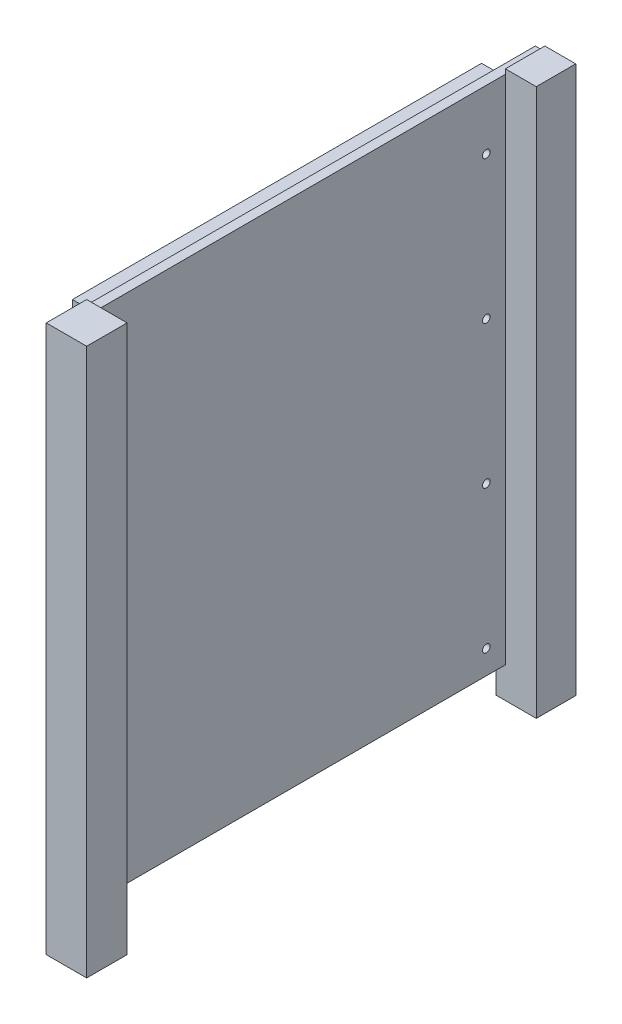
ISO-10303-21;
HEADER;
FILE_DESCRIPTION(('STEP AP214'),'2;1');
FILE_NAME('part.step','',(''),(''),'','','');
FILE_SCHEMA(('AUTOMOTIVE_DESIGN { 1 0 10303 214 1 1 1 1 }'));
ENDSEC;
DATA;
#1=APPLICATION_CONTEXT('core data for automotive mechanical design processes');
#2=APPLICATION_PROTOCOL_DEFINITION('international standard','automotive_design',2000,#1);
#3=PRODUCT_CONTEXT('',#1,'mechanical');
#4=PRODUCT('Part','Part','',(#3));
#5=PRODUCT_RELATED_PRODUCT_CATEGORY('part','',(#4));
#6=PRODUCT_DEFINITION_FORMATION('','',#4);
#7=PRODUCT_DEFINITION_CONTEXT('part definition',#1,'design');
#8=PRODUCT_DEFINITION('design','',#6,#7);
#9=PRODUCT_DEFINITION_SHAPE('','',#8);
#10=(LENGTH_UNIT() NAMED_UNIT(*) SI_UNIT(.MILLI.,.METRE.));
#11=(NAMED_UNIT(*) PLANE_ANGLE_UNIT() SI_UNIT($,.RADIAN.));
#12=(NAMED_UNIT(*) SI_UNIT($,.STERADIAN.) SOLID_ANGLE_UNIT());
#13=UNCERTAINTY_MEASURE_WITH_UNIT(LENGTH_MEASURE(1.E-05),#10,'distance_accuracy_value','');
#14=(GEOMETRIC_REPRESENTATION_CONTEXT(3) GLOBAL_UNCERTAINTY_ASSIGNED_CONTEXT((#13)) GLOBAL_UNIT_ASSIGNED_CONTEXT((#10,
#11,#12)) REPRESENTATION_CONTEXT('',''));
#15=CARTESIAN_POINT('',(0.,0.,0.));
#16=DIRECTION('',(0.,0.,1.));
#17=DIRECTION('',(1.,0.,0.));
#18=AXIS2_PLACEMENT_3D('',#15,#16,#17);
#19=CARTESIAN_POINT('',(-2.2500000000003,8.49999999999033,-6.25000000000001));
#20=DIRECTION('',(1.,0.,0.));
#21=DIRECTION('',(0.,1.,0.));
#22=AXIS2_PLACEMENT_3D('',#19,#20,#21);
#23=CYLINDRICAL_SURFACE('',#22,2.);
#24=DIRECTION('',(-1.,0.,0.));
#25=VECTOR('',#24,1.);
#26=CARTESIAN_POINT('',(-2.25000000000029,6.49999999999033,-6.25000000000001));
#27=LINE('',#26,#25);
#28=CARTESIAN_POINT('',(-4.24999999999997,6.49999999999031,-6.25000000000001));
#29=VERTEX_POINT('',#28);
#30=CARTESIAN_POINT('',(-7.25,6.49999999999034,-6.25));
#31=VERTEX_POINT('',#30);
#32=EDGE_CURVE('E265',#29,#31,#27,.T.);
#33=ORIENTED_EDGE('',*,*,#32,.F.);
#34=CARTESIAN_POINT('',(-4.24999999999997,8.49999999999031,-6.25000000000001));
#35=DIRECTION('',(1.,0.,0.));
#36=DIRECTION('',(0.,0.,-1.));
#37=AXIS2_PLACEMENT_3D('',#34,#35,#36);
#38=CIRCLE('',#37,2.);
#39=CARTESIAN_POINT('',(-4.25000000000001,8.49999999999033,-4.25));
#40=VERTEX_POINT('',#39);
#41=EDGE_CURVE('E11',#29,#40,#38,.F.);
#42=ORIENTED_EDGE('',*,*,#41,.T.);
#43=DIRECTION('',(-1.,0.,0.));
#44=VECTOR('',#43,1.);
#45=CARTESIAN_POINT('',(-2.2500000000003,8.49999999999033,-4.25));
#46=LINE('',#45,#44);
#47=CARTESIAN_POINT('',(-7.25000000000001,8.49999999999029,-4.25));
#48=VERTEX_POINT('',#47);
#49=EDGE_CURVE('E267',#48,#40,#46,.F.);
#50=ORIENTED_EDGE('',*,*,#49,.F.);
#51=CARTESIAN_POINT('',(-7.25000000000001,8.49999999999029,-6.25000000000001));
#52=DIRECTION('',(1.,0.,0.));
#53=DIRECTION('',(0.,1.,0.));
#54=AXIS2_PLACEMENT_3D('',#51,#52,#53);
#55=CIRCLE('',#54,2.);
#56=EDGE_CURVE('E43',#31,#48,#55,.F.);
#57=ORIENTED_EDGE('',*,*,#56,.F.);
#58=EDGE_LOOP('',(#33,#42,#50,#57));
#59=FACE_BOUND('',#58,.T.);
#60=ADVANCED_FACE('F35',(#59),#23,.T.);
#61=CARTESIAN_POINT('',(-7.24999999999991,8.49999999999029,-88.25));
#62=DIRECTION('',(1.,0.,0.));
#63=DIRECTION('',(0.,1.,0.));
#64=AXIS2_PLACEMENT_3D('',#61,#62,#63);
#65=CYLINDRICAL_SURFACE('',#64,2.);
#66=DIRECTION('',(-1.,0.,0.));
#67=VECTOR('',#66,1.);
#68=CARTESIAN_POINT('',(-7.2499999999999,8.49999999999029,-90.25));
#69=LINE('',#68,#67);
#70=CARTESIAN_POINT('',(-4.2499999999999,8.49999999999031,-90.25));
#71=VERTEX_POINT('',#70);
#72=CARTESIAN_POINT('',(-7.2499999999999,8.49999999999028,-90.25));
#73=VERTEX_POINT('',#72);
#74=EDGE_CURVE('E255',#71,#73,#69,.T.);
#75=ORIENTED_EDGE('',*,*,#74,.F.);
#76=CARTESIAN_POINT('',(-4.24999999999997,8.49999999999031,-88.25));
#77=DIRECTION('',(1.,0.,0.));
#78=DIRECTION('',(0.,0.,-1.));
#79=AXIS2_PLACEMENT_3D('',#76,#77,#78);
#80=CIRCLE('',#79,2.);
#81=CARTESIAN_POINT('',(-4.24999999999997,6.49999999999031,-88.25));
#82=VERTEX_POINT('',#81);
#83=EDGE_CURVE('E274',#71,#82,#80,.F.);
#84=ORIENTED_EDGE('',*,*,#83,.T.);
#85=DIRECTION('',(-1.,0.,0.));
#86=VECTOR('',#85,1.);
#87=CARTESIAN_POINT('',(-7.24999999999989,6.49999999999028,-88.25));
#88=LINE('',#87,#86);
#89=CARTESIAN_POINT('',(-7.24999999999989,6.49999999999032,-88.25));
#90=VERTEX_POINT('',#89);
#91=EDGE_CURVE('E281',#90,#82,#88,.F.);
#92=ORIENTED_EDGE('',*,*,#91,.F.);
#93=CARTESIAN_POINT('',(-7.2499999999999,8.49999999999029,-88.25));
#94=DIRECTION('',(1.,0.,0.));
#95=DIRECTION('',(0.,1.,0.));
#96=AXIS2_PLACEMENT_3D('',#93,#94,#95);
#97=CIRCLE('',#96,2.);
#98=EDGE_CURVE('E276',#73,#90,#97,.F.);
#99=ORIENTED_EDGE('',*,*,#98,.F.);
#100=EDGE_LOOP('',(#75,#84,#92,#99));
#101=FACE_BOUND('',#100,.T.);
#102=ADVANCED_FACE('F299',(#101),#65,.T.);
#103=CARTESIAN_POINT('',(-4.24999999999997,0.,0.));
#104=DIRECTION('',(1.,0.,0.));
#105=DIRECTION('',(0.,0.,-1.));
#106=AXIS2_PLACEMENT_3D('',#103,#104,#105);
#107=PLANE('',#106);
#108=DIRECTION('',(0.,1.,0.));
#109=VECTOR('',#108,1.);
#110=CARTESIAN_POINT('',(-4.25000000000059,113.49999999999,-4.25000000000001));
#111=LINE('',#110,#109);
#112=CARTESIAN_POINT('',(-4.25000000000059,113.49999999999,-4.25000000000001));
#113=VERTEX_POINT('',#112);
#114=EDGE_CURVE('E180',#40,#113,#111,.T.);
#115=ORIENTED_EDGE('',*,*,#114,.F.);
#116=ORIENTED_EDGE('',*,*,#41,.F.);
#117=DIRECTION('',(0.,0.,-1.));
#118=VECTOR('',#117,1.);
#119=CARTESIAN_POINT('',(-4.24999999999997,6.49999999999031,0.));
#120=LINE('',#119,#118);
#121=CARTESIAN_POINT('',(-4.25000000000005,6.49999999999031,-4.25));
#122=VERTEX_POINT('',#121);
#123=EDGE_CURVE('E270',#122,#29,#120,.T.);
#124=ORIENTED_EDGE('',*,*,#123,.F.);
#125=DIRECTION('',(0.,1.,0.));
#126=VECTOR('',#125,1.);
#127=CARTESIAN_POINT('',(-4.24999999999997,-2.4980018054066E-13,-4.25));
#128=LINE('',#127,#126);
#129=CARTESIAN_POINT('',(-4.24999999999997,-2.4980018054066E-13,-4.25));
#130=VERTEX_POINT('',#129);
#131=EDGE_CURVE('E383',#130,#122,#128,.T.);
#132=ORIENTED_EDGE('',*,*,#131,.F.);
#133=DIRECTION('',(0.,0.,-1.));
#134=VECTOR('',#133,1.);
#135=CARTESIAN_POINT('',(-4.24999999999997,-2.4980018054066E-13,4.25));
#136=LINE('',#135,#134);
#137=CARTESIAN_POINT('',(-4.24999999999997,-2.4980018054066E-13,4.25));
#138=VERTEX_POINT('',#137);
#139=EDGE_CURVE('E384',#138,#130,#136,.T.);
#140=ORIENTED_EDGE('',*,*,#139,.F.);
#141=DIRECTION('',(0.,-1.,0.));
#142=VECTOR('',#141,1.);
#143=CARTESIAN_POINT('',(-4.24999999999997,115.,4.25000000000001));
#144=LINE('',#143,#142);
#145=CARTESIAN_POINT('',(-4.24999999999997,115.,4.25000000000001));
#146=VERTEX_POINT('',#145);
#147=EDGE_CURVE('E389',#146,#138,#144,.T.);
#148=ORIENTED_EDGE('',*,*,#147,.F.);
#149=DIRECTION('',(0.,0.,1.));
#150=VECTOR('',#149,1.);
#151=CARTESIAN_POINT('',(-4.24999999999997,115.,-4.25));
#152=LINE('',#151,#150);
#153=CARTESIAN_POINT('',(-4.24999999999997,115.,-4.25));
#154=VERTEX_POINT('',#153);
#155=EDGE_CURVE('E382',#154,#146,#152,.T.);
#156=ORIENTED_EDGE('',*,*,#155,.F.);
#157=CARTESIAN_POINT('',(-4.24999999999997,113.999999999999,-4.25));
#158=VERTEX_POINT('',#157);
#159=EDGE_CURVE('E377',#158,#154,#128,.T.);
#160=ORIENTED_EDGE('',*,*,#159,.F.);
#161=DIRECTION('',(0.,0.,-1.));
#162=VECTOR('',#161,1.);
#163=CARTESIAN_POINT('',(-4.25000000000094,113.999999999999,-98.55));
#164=LINE('',#163,#162);
#165=CARTESIAN_POINT('',(-4.25000000000094,113.999999999999,-98.55));
#166=VERTEX_POINT('',#165);
#167=EDGE_CURVE('E224',#158,#166,#164,.T.);
#168=ORIENTED_EDGE('',*,*,#167,.T.);
#169=DIRECTION('',(0.,-1.,0.));
#170=VECTOR('',#169,1.);
#171=CARTESIAN_POINT('',(-4.24999999999998,-5.17997186715728E-13,-98.55));
#172=LINE('',#171,#170);
#173=CARTESIAN_POINT('',(-4.24999999999998,-5.17997186715728E-13,-98.55));
#174=VERTEX_POINT('',#173);
#175=EDGE_CURVE('E225',#166,#174,#172,.T.);
#176=ORIENTED_EDGE('',*,*,#175,.T.);
#177=DIRECTION('',(0.,0.,1.));
#178=VECTOR('',#177,1.);
#179=CARTESIAN_POINT('',(-4.24999999999998,-5.17997186715728E-13,-98.55));
#180=LINE('',#179,#178);
#181=CARTESIAN_POINT('',(-4.24999999999998,-5.17997186715728E-13,-90.25));
#182=VERTEX_POINT('',#181);
#183=EDGE_CURVE('E214',#174,#182,#180,.T.);
#184=ORIENTED_EDGE('',*,*,#183,.T.);
#185=DIRECTION('',(0.,1.,0.));
#186=VECTOR('',#185,1.);
#187=CARTESIAN_POINT('',(-4.24999999999998,-5.17997186715728E-13,-90.25));
#188=LINE('',#187,#186);
#189=CARTESIAN_POINT('',(-4.25000000000003,6.49999999999031,-90.25));
#190=VERTEX_POINT('',#189);
#191=EDGE_CURVE('E209',#182,#190,#188,.T.);
#192=ORIENTED_EDGE('',*,*,#191,.T.);
#193=DIRECTION('',(0.,0.,-1.));
#194=VECTOR('',#193,1.);
#195=CARTESIAN_POINT('',(-4.24999999999997,6.49999999999031,0.));
#196=LINE('',#195,#194);
#197=EDGE_CURVE('E283',#82,#190,#196,.T.);
#198=ORIENTED_EDGE('',*,*,#197,.F.);
#199=ORIENTED_EDGE('',*,*,#83,.F.);
#200=DIRECTION('',(0.,-1.,0.));
#201=VECTOR('',#200,1.);
#202=CARTESIAN_POINT('',(-4.24999999999989,6.49999999999033,-90.25));
#203=LINE('',#202,#201);
#204=CARTESIAN_POINT('',(-4.25000000000048,113.49999999999,-90.25));
#205=VERTEX_POINT('',#204);
#206=EDGE_CURVE('E166',#205,#71,#203,.T.);
#207=ORIENTED_EDGE('',*,*,#206,.F.);
#208=DIRECTION('',(0.,0.,-1.));
#209=VECTOR('',#208,1.);
#210=CARTESIAN_POINT('',(-4.25000000000048,113.49999999999,-90.25));
#211=LINE('',#210,#209);
#212=EDGE_CURVE('E263',#113,#205,#211,.T.);
#213=ORIENTED_EDGE('',*,*,#212,.F.);
#214=EDGE_LOOP('',(#115,#116,#124,#132,#140,#148,#156,#160,#168,#176,#184,#192,#198,#199,#207,#213));
#215=FACE_BOUND('',#214,.T.);
#216=ADVANCED_FACE('F298',(#215),#107,.F.);
#217=CARTESIAN_POINT('',(-2.25000000000014,0.,0.));
#218=DIRECTION('',(1.,0.,0.));
#219=DIRECTION('',(0.,1.,0.));
#220=AXIS2_PLACEMENT_3D('',#217,#218,#219);
#221=PLANE('',#220);
#222=CARTESIAN_POINT('',(-2.25000000000023,11.4999999999903,-8.25000000000011));
#223=DIRECTION('',(1.,0.,0.));
#224=DIRECTION('',(0.,1.,0.));
#225=AXIS2_PLACEMENT_3D('',#222,#223,#224);
#226=CIRCLE('',#225,0.799999999999993);
#227=CARTESIAN_POINT('',(-2.25000000000024,12.2999999999903,-8.25000000000011));
#228=VERTEX_POINT('',#227);
#229=EDGE_CURVE('E38',#228,#228,#226,.T.);
#230=ORIENTED_EDGE('',*,*,#229,.F.);
#231=EDGE_LOOP('',(#230));
#232=FACE_BOUND('',#231,.T.);
#233=CARTESIAN_POINT('',(-2.25000000000049,41.4999999999903,-8.25000000000011));
#234=DIRECTION('',(1.,0.,0.));
#235=DIRECTION('',(0.,1.,0.));
#236=AXIS2_PLACEMENT_3D('',#233,#234,#235);
#237=CIRCLE('',#236,0.799999999999992);
#238=CARTESIAN_POINT('',(-2.25000000000049,42.2999999999903,-8.25000000000011));
#239=VERTEX_POINT('',#238);
#240=EDGE_CURVE('E486',#239,#239,#237,.T.);
#241=ORIENTED_EDGE('',*,*,#240,.F.);
#242=EDGE_LOOP('',(#241));
#243=FACE_BOUND('',#242,.T.);
#244=CARTESIAN_POINT('',(-2.25000000000074,71.4999999999903,-8.25000000000011));
#245=DIRECTION('',(1.,0.,0.));
#246=DIRECTION('',(0.,1.,0.));
#247=AXIS2_PLACEMENT_3D('',#244,#245,#246);
#248=CIRCLE('',#247,0.799999999999988);
#249=CARTESIAN_POINT('',(-2.25000000000075,72.2999999999903,-8.25000000000011));
#250=VERTEX_POINT('',#249);
#251=EDGE_CURVE('E492',#250,#250,#248,.T.);
#252=ORIENTED_EDGE('',*,*,#251,.F.);
#253=EDGE_LOOP('',(#252));
#254=FACE_BOUND('',#253,.T.);
#255=CARTESIAN_POINT('',(-2.25000000000099,101.49999999999,-8.25000000000011));
#256=DIRECTION('',(1.,0.,0.));
#257=DIRECTION('',(0.,1.,0.));
#258=AXIS2_PLACEMENT_3D('',#255,#256,#257);
#259=CIRCLE('',#258,0.799999999999988);
#260=CARTESIAN_POINT('',(-2.250000000001,102.29999999999,-8.25000000000011));
#261=VERTEX_POINT('',#260);
#262=EDGE_CURVE('E498',#261,#261,#259,.T.);
#263=ORIENTED_EDGE('',*,*,#262,.F.);
#264=EDGE_LOOP('',(#263));
#265=FACE_BOUND('',#264,.T.);
#266=CARTESIAN_POINT('',(-2.25000000000022,11.4999999999903,-86.2500000000001));
#267=DIRECTION('',(1.,0.,0.));
#268=DIRECTION('',(0.,1.,0.));
#269=AXIS2_PLACEMENT_3D('',#266,#267,#268);
#270=CIRCLE('',#269,0.799999999999993);
#271=CARTESIAN_POINT('',(-2.25000000000022,12.2999999999903,-86.2500000000001));
#272=VERTEX_POINT('',#271);
#273=EDGE_CURVE('E504',#272,#272,#270,.T.);
#274=ORIENTED_EDGE('',*,*,#273,.F.);
#275=EDGE_LOOP('',(#274));
#276=FACE_BOUND('',#275,.T.);
#277=CARTESIAN_POINT('',(-2.25000000000047,41.4999999999903,-86.2500000000001));
#278=DIRECTION('',(1.,0.,0.));
#279=DIRECTION('',(0.,1.,0.));
#280=AXIS2_PLACEMENT_3D('',#277,#278,#279);
#281=CIRCLE('',#280,0.799999999999992);
#282=CARTESIAN_POINT('',(-2.25000000000048,42.2999999999903,-86.2500000000001));
#283=VERTEX_POINT('',#282);
#284=EDGE_CURVE('E510',#283,#283,#281,.T.);
#285=ORIENTED_EDGE('',*,*,#284,.F.);
#286=EDGE_LOOP('',(#285));
#287=FACE_BOUND('',#286,.T.);
#288=CARTESIAN_POINT('',(-2.25000000000072,71.4999999999903,-86.2500000000001));
#289=DIRECTION('',(1.,0.,0.));
#290=DIRECTION('',(0.,1.,0.));
#291=AXIS2_PLACEMENT_3D('',#288,#289,#290);
#292=CIRCLE('',#291,0.799999999999995);
#293=CARTESIAN_POINT('',(-2.25000000000073,72.2999999999903,-86.2500000000001));
#294=VERTEX_POINT('',#293);
#295=EDGE_CURVE('E516',#294,#294,#292,.T.);
#296=ORIENTED_EDGE('',*,*,#295,.F.);
#297=EDGE_LOOP('',(#296));
#298=FACE_BOUND('',#297,.T.);
#299=CARTESIAN_POINT('',(-2.25000000000097,101.49999999999,-86.2500000000001));
#300=DIRECTION('',(1.,0.,0.));
#301=DIRECTION('',(0.,1.,0.));
#302=AXIS2_PLACEMENT_3D('',#299,#300,#301);
#303=CIRCLE('',#302,0.799999999999995);
#304=CARTESIAN_POINT('',(-2.25000000000098,102.29999999999,-86.2500000000001));
#305=VERTEX_POINT('',#304);
#306=EDGE_CURVE('E264',#305,#305,#303,.T.);
#307=ORIENTED_EDGE('',*,*,#306,.F.);
#308=EDGE_LOOP('',(#307));
#309=FACE_BOUND('',#308,.T.);
#310=DIRECTION('',(0.,0.,1.));
#311=VECTOR('',#310,1.);
#312=CARTESIAN_POINT('',(-2.25000000000017,6.49999999999033,-90.25));
#313=LINE('',#312,#311);
#314=CARTESIAN_POINT('',(-2.25000000000244,6.49999999999033,-90.25));
#315=VERTEX_POINT('',#314);
#316=CARTESIAN_POINT('',(-2.25000000000019,6.49999999999033,-4.25));
#317=VERTEX_POINT('',#316);
#318=EDGE_CURVE('E210',#315,#317,#313,.T.);
#319=ORIENTED_EDGE('',*,*,#318,.F.);
#320=DIRECTION('',(0.,1.,0.));
#321=VECTOR('',#320,1.);
#322=CARTESIAN_POINT('',(-2.25000000000012,0.,-90.25));
#323=LINE('',#322,#321);
#324=CARTESIAN_POINT('',(-2.25000000000108,113.999999999999,-90.25));
#325=VERTEX_POINT('',#324);
#326=EDGE_CURVE('E252',#315,#325,#323,.T.);
#327=ORIENTED_EDGE('',*,*,#326,.T.);
#328=DIRECTION('',(0.,0.,-1.));
#329=VECTOR('',#328,1.);
#330=CARTESIAN_POINT('',(-2.25000000000108,113.999999999999,-98.55));
#331=LINE('',#330,#329);
#332=CARTESIAN_POINT('',(-2.2500000000011,113.999999999999,-4.24999999999996));
#333=VERTEX_POINT('',#332);
#334=EDGE_CURVE('E218',#333,#325,#331,.T.);
#335=ORIENTED_EDGE('',*,*,#334,.F.);
#336=DIRECTION('',(0.,1.,0.));
#337=VECTOR('',#336,1.);
#338=CARTESIAN_POINT('',(-2.25000000000019,6.49999999999033,-4.25));
#339=LINE('',#338,#337);
#340=EDGE_CURVE('E213',#317,#333,#339,.T.);
#341=ORIENTED_EDGE('',*,*,#340,.F.);
#342=EDGE_LOOP('',(#319,#327,#335,#341));
#343=FACE_BOUND('',#342,.T.);
#344=ADVANCED_FACE('F323',(#232,#243,#254,#265,#276,#287,#298,#309,#343),#221,.T.);
#345=CARTESIAN_POINT('',(-4.24999999999997,115.,4.25000000000001));
#346=DIRECTION('',(0.,0.,1.));
#347=DIRECTION('',(0.,-1.,0.));
#348=AXIS2_PLACEMENT_3D('',#345,#346,#347);
#349=PLANE('',#348);
#350=DIRECTION('',(0.,-1.,0.));
#351=VECTOR('',#350,1.);
#352=CARTESIAN_POINT('',(4.25000000000002,115.,4.25000000000001));
#353=LINE('',#352,#351);
#354=CARTESIAN_POINT('',(4.25000000000002,115.,4.25000000000001));
#355=VERTEX_POINT('',#354);
#356=CARTESIAN_POINT('',(4.25000000000002,-2.4980018054066E-13,4.25));
#357=VERTEX_POINT('',#356);
#358=EDGE_CURVE('E232',#355,#357,#353,.T.);
#359=ORIENTED_EDGE('',*,*,#358,.F.);
#360=DIRECTION('',(1.,0.,0.));
#361=VECTOR('',#360,1.);
#362=CARTESIAN_POINT('',(-4.24999999999997,115.,4.25000000000001));
#363=LINE('',#362,#361);
#364=EDGE_CURVE('E256',#146,#355,#363,.T.);
#365=ORIENTED_EDGE('',*,*,#364,.F.);
#366=ORIENTED_EDGE('',*,*,#147,.T.);
#367=DIRECTION('',(1.,0.,0.));
#368=VECTOR('',#367,1.);
#369=CARTESIAN_POINT('',(-4.24999999999997,-2.4980018054066E-13,4.25));
#370=LINE('',#369,#368);
#371=EDGE_CURVE('E397',#138,#357,#370,.T.);
#372=ORIENTED_EDGE('',*,*,#371,.T.);
#373=EDGE_LOOP('',(#359,#365,#366,#372));
#374=FACE_BOUND('',#373,.T.);
#375=ADVANCED_FACE('F326',(#374),#349,.T.);
#376=CARTESIAN_POINT('',(-4.24999999999997,115.,-4.25));
#377=DIRECTION('',(0.,1.,0.));
#378=DIRECTION('',(0.,0.,1.));
#379=AXIS2_PLACEMENT_3D('',#376,#377,#378);
#380=PLANE('',#379);
#381=DIRECTION('',(0.,0.,1.));
#382=VECTOR('',#381,1.);
#383=CARTESIAN_POINT('',(4.25000000000002,115.,-4.25));
#384=LINE('',#383,#382);
#385=CARTESIAN_POINT('',(4.25000000000002,115.,-4.25));
#386=VERTEX_POINT('',#385);
#387=EDGE_CURVE('E406',#386,#355,#384,.T.);
#388=ORIENTED_EDGE('',*,*,#387,.F.);
#389=DIRECTION('',(1.,0.,0.));
#390=VECTOR('',#389,1.);
#391=CARTESIAN_POINT('',(-4.24999999999997,115.,-4.25));
#392=LINE('',#391,#390);
#393=EDGE_CURVE('E410',#154,#386,#392,.T.);
#394=ORIENTED_EDGE('',*,*,#393,.F.);
#395=ORIENTED_EDGE('',*,*,#155,.T.);
#396=ORIENTED_EDGE('',*,*,#364,.T.);
#397=EDGE_LOOP('',(#388,#394,#395,#396));
#398=FACE_BOUND('',#397,.T.);
#399=ADVANCED_FACE('F329',(#398),#380,.T.);
#400=CARTESIAN_POINT('',(-4.24999999999997,-2.4980018054066E-13,-4.25));
#401=DIRECTION('',(0.,0.,-1.));
#402=DIRECTION('',(-1.,0.,0.));
#403=AXIS2_PLACEMENT_3D('',#400,#401,#402);
#404=PLANE('',#403);
#405=DIRECTION('',(-1.,0.,0.));
#406=VECTOR('',#405,1.);
#407=CARTESIAN_POINT('',(-2.25000000000019,6.49999999999033,-4.25));
#408=LINE('',#407,#406);
#409=EDGE_CURVE('E245',#317,#122,#408,.T.);
#410=ORIENTED_EDGE('',*,*,#409,.F.);
#411=ORIENTED_EDGE('',*,*,#340,.T.);
#412=DIRECTION('',(-1.,0.,0.));
#413=VECTOR('',#412,1.);
#414=CARTESIAN_POINT('',(-2.2500000000011,113.999999999999,-4.24999999999996));
#415=LINE('',#414,#413);
#416=EDGE_CURVE('E237',#333,#158,#415,.T.);
#417=ORIENTED_EDGE('',*,*,#416,.T.);
#418=ORIENTED_EDGE('',*,*,#159,.T.);
#419=ORIENTED_EDGE('',*,*,#393,.T.);
#420=DIRECTION('',(0.,1.,0.));
#421=VECTOR('',#420,1.);
#422=CARTESIAN_POINT('',(4.25000000000002,-2.4980018054066E-13,-4.25));
#423=LINE('',#422,#421);
#424=CARTESIAN_POINT('',(4.25000000000002,-2.4980018054066E-13,-4.25));
#425=VERTEX_POINT('',#424);
#426=EDGE_CURVE('E403',#425,#386,#423,.T.);
#427=ORIENTED_EDGE('',*,*,#426,.F.);
#428=DIRECTION('',(1.,0.,0.));
#429=VECTOR('',#428,1.);
#430=CARTESIAN_POINT('',(-4.24999999999997,-2.4980018054066E-13,-4.25));
#431=LINE('',#430,#429);
#432=EDGE_CURVE('E412',#130,#425,#431,.T.);
#433=ORIENTED_EDGE('',*,*,#432,.F.);
#434=ORIENTED_EDGE('',*,*,#131,.T.);
#435=EDGE_LOOP('',(#410,#411,#417,#418,#419,#427,#433,#434));
#436=FACE_BOUND('',#435,.T.);
#437=ADVANCED_FACE('F335',(#436),#404,.T.);
#438=CARTESIAN_POINT('',(-4.24999999999997,-2.4980018054066E-13,4.25));
#439=DIRECTION('',(0.,-1.,0.));
#440=DIRECTION('',(0.,0.,-1.));
#441=AXIS2_PLACEMENT_3D('',#438,#439,#440);
#442=PLANE('',#441);
#443=DIRECTION('',(0.,0.,-1.));
#444=VECTOR('',#443,1.);
#445=CARTESIAN_POINT('',(4.25000000000002,-2.4980018054066E-13,4.25));
#446=LINE('',#445,#444);
#447=EDGE_CURVE('E400',#357,#425,#446,.T.);
#448=ORIENTED_EDGE('',*,*,#447,.F.);
#449=ORIENTED_EDGE('',*,*,#371,.F.);
#450=ORIENTED_EDGE('',*,*,#139,.T.);
#451=ORIENTED_EDGE('',*,*,#432,.T.);
#452=EDGE_LOOP('',(#448,#449,#450,#451));
#453=FACE_BOUND('',#452,.T.);
#454=ADVANCED_FACE('F331',(#453),#442,.T.);
#455=CARTESIAN_POINT('',(4.25000000000002,0.,0.));
#456=DIRECTION('',(1.,0.,0.));
#457=DIRECTION('',(0.,0.,-1.));
#458=AXIS2_PLACEMENT_3D('',#455,#456,#457);
#459=PLANE('',#458);
#460=ORIENTED_EDGE('',*,*,#358,.T.);
#461=ORIENTED_EDGE('',*,*,#447,.T.);
#462=ORIENTED_EDGE('',*,*,#426,.T.);
#463=ORIENTED_EDGE('',*,*,#387,.T.);
#464=EDGE_LOOP('',(#460,#461,#462,#463));
#465=FACE_BOUND('',#464,.T.);
#466=ADVANCED_FACE('F334',(#465),#459,.T.);
#467=CARTESIAN_POINT('',(-2.25000000000012,-5.01177307892658E-13,-90.25));
#468=DIRECTION('',(0.,0.,1.));
#469=DIRECTION('',(1.,0.,0.));
#470=AXIS2_PLACEMENT_3D('',#467,#468,#469);
#471=PLANE('',#470);
#472=ORIENTED_EDGE('',*,*,#191,.F.);
#473=DIRECTION('',(-1.,0.,0.));
#474=VECTOR('',#473,1.);
#475=CARTESIAN_POINT('',(-2.25000000000012,-5.01177307892658E-13,-90.25));
#476=LINE('',#475,#474);
#477=CARTESIAN_POINT('',(4.24999999999865,1.20785061029376E-12,-90.2500000000001));
#478=VERTEX_POINT('',#477);
#479=EDGE_CURVE('E230',#478,#182,#476,.T.);
#480=ORIENTED_EDGE('',*,*,#479,.F.);
#481=DIRECTION('',(1.67600685745298E-13,-1.,0.));
#482=VECTOR('',#481,1.);
#483=CARTESIAN_POINT('',(4.24999999999865,1.20785061029376E-12,-90.2500000000001));
#484=LINE('',#483,#482);
#485=CARTESIAN_POINT('',(4.24999999997938,115.000000000001,-90.2500000000001));
#486=VERTEX_POINT('',#485);
#487=EDGE_CURVE('E198',#486,#478,#484,.T.);
#488=ORIENTED_EDGE('',*,*,#487,.F.);
#489=DIRECTION('',(-1.,-1.67600975833073E-13,0.));
#490=VECTOR('',#489,1.);
#491=CARTESIAN_POINT('',(4.24999999997938,115.000000000001,-90.2500000000001));
#492=LINE('',#491,#490);
#493=CARTESIAN_POINT('',(-2.25000000002062,115.,-90.25));
#494=VERTEX_POINT('',#493);
#495=EDGE_CURVE('E200',#486,#494,#492,.T.);
#496=ORIENTED_EDGE('',*,*,#495,.T.);
#497=DIRECTION('',(1.67600685745298E-13,-1.,0.));
#498=VECTOR('',#497,1.);
#499=CARTESIAN_POINT('',(-2.25000000000135,1.18444267378793E-13,-90.25));
#500=LINE('',#499,#498);
#501=EDGE_CURVE('E194',#494,#325,#500,.T.);
#502=ORIENTED_EDGE('',*,*,#501,.T.);
#503=ORIENTED_EDGE('',*,*,#326,.F.);
#504=DIRECTION('',(-1.,0.,0.));
#505=VECTOR('',#504,1.);
#506=CARTESIAN_POINT('',(-2.25000000000017,6.49999999999033,-90.25));
#507=LINE('',#506,#505);
#508=EDGE_CURVE('E221',#315,#190,#507,.T.);
#509=ORIENTED_EDGE('',*,*,#508,.T.);
#510=EDGE_LOOP('',(#472,#480,#488,#496,#502,#503,#509));
#511=FACE_BOUND('',#510,.T.);
#512=ADVANCED_FACE('F344',(#511),#471,.T.);
#513=CARTESIAN_POINT('',(-2.25000000000012,-5.01177307892658E-13,-98.55));
#514=DIRECTION('',(0.,-1.,0.));
#515=DIRECTION('',(1.,0.,0.));
#516=AXIS2_PLACEMENT_3D('',#513,#514,#515);
#517=PLANE('',#516);
#518=ORIENTED_EDGE('',*,*,#183,.F.);
#519=DIRECTION('',(-1.,0.,0.));
#520=VECTOR('',#519,1.);
#521=CARTESIAN_POINT('',(-2.25000000000012,-5.01177307892658E-13,-98.55));
#522=LINE('',#521,#520);
#523=CARTESIAN_POINT('',(4.24999999999854,1.20837720841738E-12,-98.5500000000001));
#524=VERTEX_POINT('',#523);
#525=EDGE_CURVE('E233',#524,#174,#522,.T.);
#526=ORIENTED_EDGE('',*,*,#525,.F.);
#527=DIRECTION('',(0.,0.,-1.));
#528=VECTOR('',#527,1.);
#529=CARTESIAN_POINT('',(4.24999999999854,1.20837720841738E-12,-98.5500000000001));
#530=LINE('',#529,#528);
#531=EDGE_CURVE('E190',#478,#524,#530,.T.);
#532=ORIENTED_EDGE('',*,*,#531,.F.);
#533=ORIENTED_EDGE('',*,*,#479,.T.);
#534=EDGE_LOOP('',(#518,#526,#532,#533));
#535=FACE_BOUND('',#534,.T.);
#536=ADVANCED_FACE('F347',(#535),#517,.T.);
#537=CARTESIAN_POINT('',(-2.25000000000012,-5.01177307892658E-13,-98.55));
#538=DIRECTION('',(0.,0.,-1.));
#539=DIRECTION('',(0.,1.,0.));
#540=AXIS2_PLACEMENT_3D('',#537,#538,#539);
#541=PLANE('',#540);
#542=ORIENTED_EDGE('',*,*,#175,.F.);
#543=DIRECTION('',(-1.,0.,0.));
#544=VECTOR('',#543,1.);
#545=CARTESIAN_POINT('',(-2.25000000000108,113.999999999999,-98.55));
#546=LINE('',#545,#544);
#547=CARTESIAN_POINT('',(-2.25000000002057,113.999999999999,-98.55));
#548=VERTEX_POINT('',#547);
#549=EDGE_CURVE('E235',#548,#166,#546,.T.);
#550=ORIENTED_EDGE('',*,*,#549,.F.);
#551=DIRECTION('',(-1.67600685745298E-13,1.,0.));
#552=VECTOR('',#551,1.);
#553=CARTESIAN_POINT('',(-2.25000000002074,115.,-98.55));
#554=LINE('',#553,#552);
#555=CARTESIAN_POINT('',(-2.25000000002074,115.,-98.55));
#556=VERTEX_POINT('',#555);
#557=EDGE_CURVE('E182',#548,#556,#554,.T.);
#558=ORIENTED_EDGE('',*,*,#557,.T.);
#559=DIRECTION('',(-1.,-1.67600975833073E-13,0.));
#560=VECTOR('',#559,1.);
#561=CARTESIAN_POINT('',(4.24999999997926,115.000000000001,-98.5500000000001));
#562=LINE('',#561,#560);
#563=CARTESIAN_POINT('',(4.24999999997926,115.000000000001,-98.5500000000001));
#564=VERTEX_POINT('',#563);
#565=EDGE_CURVE('E206',#564,#556,#562,.T.);
#566=ORIENTED_EDGE('',*,*,#565,.F.);
#567=DIRECTION('',(-1.67600685745298E-13,1.,0.));
#568=VECTOR('',#567,1.);
#569=CARTESIAN_POINT('',(4.24999999997926,115.000000000001,-98.5500000000001));
#570=LINE('',#569,#568);
#571=EDGE_CURVE('E193',#524,#564,#570,.T.);
#572=ORIENTED_EDGE('',*,*,#571,.F.);
#573=ORIENTED_EDGE('',*,*,#525,.T.);
#574=EDGE_LOOP('',(#542,#550,#558,#566,#572,#573));
#575=FACE_BOUND('',#574,.T.);
#576=ADVANCED_FACE('F312',(#575),#541,.T.);
#577=CARTESIAN_POINT('',(-2.25000000000108,113.999999999999,-98.55));
#578=DIRECTION('',(0.,1.,0.));
#579=DIRECTION('',(-1.,0.,0.));
#580=AXIS2_PLACEMENT_3D('',#577,#578,#579);
#581=PLANE('',#580);
#582=ORIENTED_EDGE('',*,*,#167,.F.);
#583=ORIENTED_EDGE('',*,*,#416,.F.);
#584=ORIENTED_EDGE('',*,*,#334,.T.);
#585=EDGE_CURVE('E217',#325,#548,#331,.T.);
#586=ORIENTED_EDGE('',*,*,#585,.T.);
#587=ORIENTED_EDGE('',*,*,#549,.T.);
#588=EDGE_LOOP('',(#582,#583,#584,#586,#587));
#589=FACE_BOUND('',#588,.T.);
#590=ADVANCED_FACE('F303',(#589),#581,.T.);
#591=CARTESIAN_POINT('',(-2.25000000000017,6.49999999999033,-90.25));
#592=DIRECTION('',(0.,-1.,0.));
#593=DIRECTION('',(1.,0.,0.));
#594=AXIS2_PLACEMENT_3D('',#591,#592,#593);
#595=PLANE('',#594);
#596=ORIENTED_EDGE('',*,*,#123,.T.);
#597=ORIENTED_EDGE('',*,*,#32,.T.);
#598=DIRECTION('',(0.,0.,1.));
#599=VECTOR('',#598,1.);
#600=CARTESIAN_POINT('',(-7.25,6.49999999999034,-4.25));
#601=LINE('',#600,#599);
#602=EDGE_CURVE('E186',#90,#31,#601,.T.);
#603=ORIENTED_EDGE('',*,*,#602,.F.);
#604=ORIENTED_EDGE('',*,*,#91,.T.);
#605=ORIENTED_EDGE('',*,*,#197,.T.);
#606=ORIENTED_EDGE('',*,*,#508,.F.);
#607=ORIENTED_EDGE('',*,*,#318,.T.);
#608=ORIENTED_EDGE('',*,*,#409,.T.);
#609=EDGE_LOOP('',(#596,#597,#603,#604,#605,#606,#607,#608));
#610=FACE_BOUND('',#609,.T.);
#611=ADVANCED_FACE('F300',(#610),#595,.T.);
#612=CARTESIAN_POINT('',(4.24999999997938,115.000000000001,-90.2500000000001));
#613=DIRECTION('',(1.67600975833073E-13,-1.,0.));
#614=DIRECTION('',(1.,1.67600975833073E-13,0.));
#615=AXIS2_PLACEMENT_3D('',#612,#613,#614);
#616=PLANE('',#615);
#617=DIRECTION('',(0.,0.,1.));
#618=VECTOR('',#617,1.);
#619=CARTESIAN_POINT('',(-2.25000000002062,115.,-90.25));
#620=LINE('',#619,#618);
#621=EDGE_CURVE('E184',#556,#494,#620,.T.);
#622=ORIENTED_EDGE('',*,*,#621,.T.);
#623=ORIENTED_EDGE('',*,*,#495,.F.);
#624=DIRECTION('',(0.,0.,1.));
#625=VECTOR('',#624,1.);
#626=CARTESIAN_POINT('',(4.24999999997938,115.000000000001,-90.2500000000001));
#627=LINE('',#626,#625);
#628=EDGE_CURVE('E196',#564,#486,#627,.T.);
#629=ORIENTED_EDGE('',*,*,#628,.F.);
#630=ORIENTED_EDGE('',*,*,#565,.T.);
#631=EDGE_LOOP('',(#622,#623,#629,#630));
#632=FACE_BOUND('',#631,.T.);
#633=ADVANCED_FACE('F302',(#632),#616,.F.);
#634=CARTESIAN_POINT('',(4.24999999999986,7.12304799988027E-13,0.));
#635=DIRECTION('',(-1.,-1.67600685745298E-13,0.));
#636=DIRECTION('',(1.67600685745298E-13,-1.,0.));
#637=AXIS2_PLACEMENT_3D('',#634,#635,#636);
#638=PLANE('',#637);
#639=ORIENTED_EDGE('',*,*,#531,.T.);
#640=ORIENTED_EDGE('',*,*,#571,.T.);
#641=ORIENTED_EDGE('',*,*,#628,.T.);
#642=ORIENTED_EDGE('',*,*,#487,.T.);
#643=EDGE_LOOP('',(#639,#640,#641,#642));
#644=FACE_BOUND('',#643,.T.);
#645=ADVANCED_FACE('F309',(#644),#638,.F.);
#646=CARTESIAN_POINT('',(-2.25000000000014,-3.77101542926944E-13,0.));
#647=DIRECTION('',(-1.,-1.67600685745298E-13,0.));
#648=DIRECTION('',(1.67600685745298E-13,-1.,0.));
#649=AXIS2_PLACEMENT_3D('',#646,#647,#648);
#650=PLANE('',#649);
#651=ORIENTED_EDGE('',*,*,#557,.F.);
#652=ORIENTED_EDGE('',*,*,#585,.F.);
#653=ORIENTED_EDGE('',*,*,#501,.F.);
#654=ORIENTED_EDGE('',*,*,#621,.F.);
#655=EDGE_LOOP('',(#651,#652,#653,#654));
#656=FACE_BOUND('',#655,.T.);
#657=ADVANCED_FACE('F369',(#656),#650,.T.);
#658=CARTESIAN_POINT('',(-7.25000000000059,113.49999999999,-4.25000000000002));
#659=DIRECTION('',(0.,0.,-1.));
#660=DIRECTION('',(-1.,0.,0.));
#661=AXIS2_PLACEMENT_3D('',#658,#659,#660);
#662=PLANE('',#661);
#663=DIRECTION('',(0.,1.,0.));
#664=VECTOR('',#663,1.);
#665=CARTESIAN_POINT('',(-7.25000000000059,113.49999999999,-4.25000000000002));
#666=LINE('',#665,#664);
#667=CARTESIAN_POINT('',(-7.25000000000059,113.49999999999,-4.25000000000002));
#668=VERTEX_POINT('',#667);
#669=EDGE_CURVE('E158',#48,#668,#666,.T.);
#670=ORIENTED_EDGE('',*,*,#669,.F.);
#671=ORIENTED_EDGE('',*,*,#49,.T.);
#672=ORIENTED_EDGE('',*,*,#114,.T.);
#673=DIRECTION('',(1.,0.,0.));
#674=VECTOR('',#673,1.);
#675=CARTESIAN_POINT('',(-7.25000000000059,113.49999999999,-4.25000000000002));
#676=LINE('',#675,#674);
#677=EDGE_CURVE('E172',#668,#113,#676,.T.);
#678=ORIENTED_EDGE('',*,*,#677,.F.);
#679=EDGE_LOOP('',(#670,#671,#672,#678));
#680=FACE_BOUND('',#679,.T.);
#681=ADVANCED_FACE('F178',(#680),#662,.F.);
#682=CARTESIAN_POINT('',(-7.25000000000048,113.49999999999,-90.25));
#683=DIRECTION('',(0.,-1.,0.));
#684=DIRECTION('',(1.,0.,0.));
#685=AXIS2_PLACEMENT_3D('',#682,#683,#684);
#686=PLANE('',#685);
#687=ORIENTED_EDGE('',*,*,#212,.T.);
#688=DIRECTION('',(1.,0.,0.));
#689=VECTOR('',#688,1.);
#690=CARTESIAN_POINT('',(-7.25000000000048,113.49999999999,-90.25));
#691=LINE('',#690,#689);
#692=CARTESIAN_POINT('',(-7.25000000000048,113.49999999999,-90.25));
#693=VERTEX_POINT('',#692);
#694=EDGE_CURVE('E174',#693,#205,#691,.T.);
#695=ORIENTED_EDGE('',*,*,#694,.F.);
#696=DIRECTION('',(0.,0.,-1.));
#697=VECTOR('',#696,1.);
#698=CARTESIAN_POINT('',(-7.25000000000048,113.49999999999,-90.25));
#699=LINE('',#698,#697);
#700=EDGE_CURVE('E162',#668,#693,#699,.T.);
#701=ORIENTED_EDGE('',*,*,#700,.F.);
#702=ORIENTED_EDGE('',*,*,#677,.T.);
#703=EDGE_LOOP('',(#687,#695,#701,#702));
#704=FACE_BOUND('',#703,.T.);
#705=ADVANCED_FACE('F171',(#704),#686,.F.);
#706=CARTESIAN_POINT('',(-7.24999999999989,6.49999999999032,-90.25));
#707=DIRECTION('',(0.,0.,1.));
#708=DIRECTION('',(1.,0.,0.));
#709=AXIS2_PLACEMENT_3D('',#706,#707,#708);
#710=PLANE('',#709);
#711=ORIENTED_EDGE('',*,*,#206,.T.);
#712=ORIENTED_EDGE('',*,*,#74,.T.);
#713=DIRECTION('',(0.,-1.,0.));
#714=VECTOR('',#713,1.);
#715=CARTESIAN_POINT('',(-7.24999999999989,6.49999999999032,-90.25));
#716=LINE('',#715,#714);
#717=EDGE_CURVE('E176',#693,#73,#716,.T.);
#718=ORIENTED_EDGE('',*,*,#717,.F.);
#719=ORIENTED_EDGE('',*,*,#694,.T.);
#720=EDGE_LOOP('',(#711,#712,#718,#719));
#721=FACE_BOUND('',#720,.T.);
#722=ADVANCED_FACE('F291',(#721),#710,.F.);
#723=CARTESIAN_POINT('',(-7.24999999999997,0.,0.));
#724=DIRECTION('',(1.,0.,0.));
#725=DIRECTION('',(0.,1.,0.));
#726=AXIS2_PLACEMENT_3D('',#723,#724,#725);
#727=PLANE('',#726);
#728=CARTESIAN_POINT('',(-7.25000000000002,11.4999999999903,-8.25000000000012));
#729=DIRECTION('',(-1.,0.,0.));
#730=DIRECTION('',(0.,0.,1.));
#731=AXIS2_PLACEMENT_3D('',#728,#729,#730);
#732=CIRCLE('',#731,0.799999999999988);
#733=CARTESIAN_POINT('',(-7.25000000000003,11.4999999999903,-7.45000000000013));
#734=VERTEX_POINT('',#733);
#735=EDGE_CURVE('E480',#734,#734,#732,.T.);
#736=ORIENTED_EDGE('',*,*,#735,.F.);
#737=EDGE_LOOP('',(#736));
#738=FACE_BOUND('',#737,.T.);
#739=CARTESIAN_POINT('',(-7.25000000000019,41.4999999999903,-8.25000000000012));
#740=DIRECTION('',(-1.,0.,0.));
#741=DIRECTION('',(0.,0.,1.));
#742=AXIS2_PLACEMENT_3D('',#739,#740,#741);
#743=CIRCLE('',#742,0.799999999999988);
#744=CARTESIAN_POINT('',(-7.25000000000019,41.4999999999903,-7.45000000000013));
#745=VERTEX_POINT('',#744);
#746=EDGE_CURVE('E482',#745,#745,#743,.T.);
#747=ORIENTED_EDGE('',*,*,#746,.F.);
#748=EDGE_LOOP('',(#747));
#749=FACE_BOUND('',#748,.T.);
#750=CARTESIAN_POINT('',(-7.25000000000036,71.4999999999903,-8.25000000000012));
#751=DIRECTION('',(-1.,0.,0.));
#752=DIRECTION('',(0.,0.,1.));
#753=AXIS2_PLACEMENT_3D('',#750,#751,#752);
#754=CIRCLE('',#753,0.799999999999981);
#755=CARTESIAN_POINT('',(-7.25000000000036,71.4999999999903,-7.45000000000013));
#756=VERTEX_POINT('',#755);
#757=EDGE_CURVE('E489',#756,#756,#754,.T.);
#758=ORIENTED_EDGE('',*,*,#757,.F.);
#759=EDGE_LOOP('',(#758));
#760=FACE_BOUND('',#759,.T.);
#761=CARTESIAN_POINT('',(-7.25000000000052,101.49999999999,-8.25000000000012));
#762=DIRECTION('',(-1.,0.,0.));
#763=DIRECTION('',(0.,0.,1.));
#764=AXIS2_PLACEMENT_3D('',#761,#762,#763);
#765=CIRCLE('',#764,0.799999999999981);
#766=CARTESIAN_POINT('',(-7.25000000000052,101.49999999999,-7.45000000000013));
#767=VERTEX_POINT('',#766);
#768=EDGE_CURVE('E495',#767,#767,#765,.T.);
#769=ORIENTED_EDGE('',*,*,#768,.F.);
#770=EDGE_LOOP('',(#769));
#771=FACE_BOUND('',#770,.T.);
#772=CARTESIAN_POINT('',(-7.24999999999992,11.4999999999903,-86.2500000000001));
#773=DIRECTION('',(-1.,0.,0.));
#774=DIRECTION('',(0.,0.,1.));
#775=AXIS2_PLACEMENT_3D('',#772,#773,#774);
#776=CIRCLE('',#775,0.799999999999988);
#777=CARTESIAN_POINT('',(-7.24999999999992,11.4999999999903,-85.4500000000001));
#778=VERTEX_POINT('',#777);
#779=EDGE_CURVE('E501',#778,#778,#776,.T.);
#780=ORIENTED_EDGE('',*,*,#779,.F.);
#781=EDGE_LOOP('',(#780));
#782=FACE_BOUND('',#781,.T.);
#783=CARTESIAN_POINT('',(-7.25000000000009,41.4999999999903,-86.2500000000001));
#784=DIRECTION('',(-1.,0.,0.));
#785=DIRECTION('',(0.,0.,1.));
#786=AXIS2_PLACEMENT_3D('',#783,#784,#785);
#787=CIRCLE('',#786,0.799999999999988);
#788=CARTESIAN_POINT('',(-7.25000000000009,41.4999999999903,-85.4500000000001));
#789=VERTEX_POINT('',#788);
#790=EDGE_CURVE('E507',#789,#789,#787,.T.);
#791=ORIENTED_EDGE('',*,*,#790,.F.);
#792=EDGE_LOOP('',(#791));
#793=FACE_BOUND('',#792,.T.);
#794=CARTESIAN_POINT('',(-7.25000000000025,71.4999999999903,-86.2500000000001));
#795=DIRECTION('',(-1.,0.,0.));
#796=DIRECTION('',(0.,0.,1.));
#797=AXIS2_PLACEMENT_3D('',#794,#795,#796);
#798=CIRCLE('',#797,0.799999999999995);
#799=CARTESIAN_POINT('',(-7.25000000000026,71.4999999999903,-85.4500000000001));
#800=VERTEX_POINT('',#799);
#801=EDGE_CURVE('E513',#800,#800,#798,.T.);
#802=ORIENTED_EDGE('',*,*,#801,.F.);
#803=EDGE_LOOP('',(#802));
#804=FACE_BOUND('',#803,.T.);
#805=CARTESIAN_POINT('',(-7.25000000000042,101.49999999999,-86.2500000000001));
#806=DIRECTION('',(-1.,0.,0.));
#807=DIRECTION('',(0.,0.,1.));
#808=AXIS2_PLACEMENT_3D('',#805,#806,#807);
#809=CIRCLE('',#808,0.799999999999995);
#810=CARTESIAN_POINT('',(-7.25000000000042,101.49999999999,-85.4500000000001));
#811=VERTEX_POINT('',#810);
#812=EDGE_CURVE('E519',#811,#811,#809,.T.);
#813=ORIENTED_EDGE('',*,*,#812,.F.);
#814=EDGE_LOOP('',(#813));
#815=FACE_BOUND('',#814,.T.);
#816=ORIENTED_EDGE('',*,*,#602,.T.);
#817=ORIENTED_EDGE('',*,*,#56,.T.);
#818=ORIENTED_EDGE('',*,*,#669,.T.);
#819=ORIENTED_EDGE('',*,*,#700,.T.);
#820=ORIENTED_EDGE('',*,*,#717,.T.);
#821=ORIENTED_EDGE('',*,*,#98,.T.);
#822=EDGE_LOOP('',(#816,#817,#818,#819,#820,#821));
#823=FACE_BOUND('',#822,.T.);
#824=ADVANCED_FACE('F160',(#738,#749,#760,#771,#782,#793,#804,#815,#823),#727,.F.);
#825=CARTESIAN_POINT('',(-7.25000000000042,101.49999999999,-86.2500000000001));
#826=DIRECTION('',(-1.,0.,0.));
#827=DIRECTION('',(0.,0.,1.));
#828=AXIS2_PLACEMENT_3D('',#825,#826,#827);
#829=CYLINDRICAL_SURFACE('',#828,0.799999999999995);
#830=ORIENTED_EDGE('',*,*,#306,.T.);
#831=EDGE_LOOP('',(#830));
#832=FACE_BOUND('',#831,.T.);
#833=ORIENTED_EDGE('',*,*,#812,.T.);
#834=EDGE_LOOP('',(#833));
#835=FACE_BOUND('',#834,.T.);
#836=ADVANCED_FACE('F441',(#832,#835),#829,.F.);
#837=CARTESIAN_POINT('',(-7.25000000000025,71.4999999999903,-86.2500000000001));
#838=DIRECTION('',(-1.,0.,0.));
#839=DIRECTION('',(0.,0.,1.));
#840=AXIS2_PLACEMENT_3D('',#837,#838,#839);
#841=CYLINDRICAL_SURFACE('',#840,0.799999999999995);
#842=ORIENTED_EDGE('',*,*,#295,.T.);
#843=EDGE_LOOP('',(#842));
#844=FACE_BOUND('',#843,.T.);
#845=ORIENTED_EDGE('',*,*,#801,.T.);
#846=EDGE_LOOP('',(#845));
#847=FACE_BOUND('',#846,.T.);
#848=ADVANCED_FACE('F445',(#844,#847),#841,.F.);
#849=CARTESIAN_POINT('',(-7.25000000000009,41.4999999999903,-86.2500000000001));
#850=DIRECTION('',(-1.,0.,0.));
#851=DIRECTION('',(0.,0.,1.));
#852=AXIS2_PLACEMENT_3D('',#849,#850,#851);
#853=CYLINDRICAL_SURFACE('',#852,0.799999999999992);
#854=ORIENTED_EDGE('',*,*,#284,.T.);
#855=EDGE_LOOP('',(#854));
#856=FACE_BOUND('',#855,.T.);
#857=ORIENTED_EDGE('',*,*,#790,.T.);
#858=EDGE_LOOP('',(#857));
#859=FACE_BOUND('',#858,.T.);
#860=ADVANCED_FACE('F449',(#856,#859),#853,.F.);
#861=CARTESIAN_POINT('',(-7.24999999999992,11.4999999999903,-86.2500000000001));
#862=DIRECTION('',(-1.,0.,0.));
#863=DIRECTION('',(0.,0.,1.));
#864=AXIS2_PLACEMENT_3D('',#861,#862,#863);
#865=CYLINDRICAL_SURFACE('',#864,0.799999999999993);
#866=ORIENTED_EDGE('',*,*,#273,.T.);
#867=EDGE_LOOP('',(#866));
#868=FACE_BOUND('',#867,.T.);
#869=ORIENTED_EDGE('',*,*,#779,.T.);
#870=EDGE_LOOP('',(#869));
#871=FACE_BOUND('',#870,.T.);
#872=ADVANCED_FACE('F453',(#868,#871),#865,.F.);
#873=CARTESIAN_POINT('',(-7.25000000000052,101.49999999999,-8.25000000000012));
#874=DIRECTION('',(-1.,0.,0.));
#875=DIRECTION('',(0.,0.,1.));
#876=AXIS2_PLACEMENT_3D('',#873,#874,#875);
#877=CYLINDRICAL_SURFACE('',#876,0.799999999999988);
#878=ORIENTED_EDGE('',*,*,#262,.T.);
#879=EDGE_LOOP('',(#878));
#880=FACE_BOUND('',#879,.T.);
#881=ORIENTED_EDGE('',*,*,#768,.T.);
#882=EDGE_LOOP('',(#881));
#883=FACE_BOUND('',#882,.T.);
#884=ADVANCED_FACE('F457',(#880,#883),#877,.F.);
#885=CARTESIAN_POINT('',(-7.25000000000036,71.4999999999903,-8.25000000000012));
#886=DIRECTION('',(-1.,0.,0.));
#887=DIRECTION('',(0.,0.,1.));
#888=AXIS2_PLACEMENT_3D('',#885,#886,#887);
#889=CYLINDRICAL_SURFACE('',#888,0.799999999999988);
#890=ORIENTED_EDGE('',*,*,#251,.T.);
#891=EDGE_LOOP('',(#890));
#892=FACE_BOUND('',#891,.T.);
#893=ORIENTED_EDGE('',*,*,#757,.T.);
#894=EDGE_LOOP('',(#893));
#895=FACE_BOUND('',#894,.T.);
#896=ADVANCED_FACE('F461',(#892,#895),#889,.F.);
#897=CARTESIAN_POINT('',(-7.25000000000019,41.4999999999903,-8.25000000000012));
#898=DIRECTION('',(-1.,0.,0.));
#899=DIRECTION('',(0.,0.,1.));
#900=AXIS2_PLACEMENT_3D('',#897,#898,#899);
#901=CYLINDRICAL_SURFACE('',#900,0.799999999999992);
#902=ORIENTED_EDGE('',*,*,#240,.T.);
#903=EDGE_LOOP('',(#902));
#904=FACE_BOUND('',#903,.T.);
#905=ORIENTED_EDGE('',*,*,#746,.T.);
#906=EDGE_LOOP('',(#905));
#907=FACE_BOUND('',#906,.T.);
#908=ADVANCED_FACE('F465',(#904,#907),#901,.F.);
#909=CARTESIAN_POINT('',(-7.25000000000002,11.4999999999903,-8.25000000000012));
#910=DIRECTION('',(-1.,0.,0.));
#911=DIRECTION('',(0.,0.,1.));
#912=AXIS2_PLACEMENT_3D('',#909,#910,#911);
#913=CYLINDRICAL_SURFACE('',#912,0.799999999999993);
#914=ORIENTED_EDGE('',*,*,#229,.T.);
#915=EDGE_LOOP('',(#914));
#916=FACE_BOUND('',#915,.T.);
#917=ORIENTED_EDGE('',*,*,#735,.T.);
#918=EDGE_LOOP('',(#917));
#919=FACE_BOUND('',#918,.T.);
#920=ADVANCED_FACE('F469',(#916,#919),#913,.F.);
#921=CLOSED_SHELL('',(#60,#102,#216,#344,#375,#399,#437,#454,#466,#512,#536,#576,#590,#611,#633,
#645,#657,#681,#705,#722,#824,#836,#848,#860,#872,#884,#896,#908,#920));
#922=MANIFOLD_SOLID_BREP('B2',#921);
#923=ADVANCED_BREP_SHAPE_REPRESENTATION('',(#18,#922),#14);
#924=SHAPE_DEFINITION_REPRESENTATION(#9,#923);
ENDSEC;
END-ISO-10303-21;
